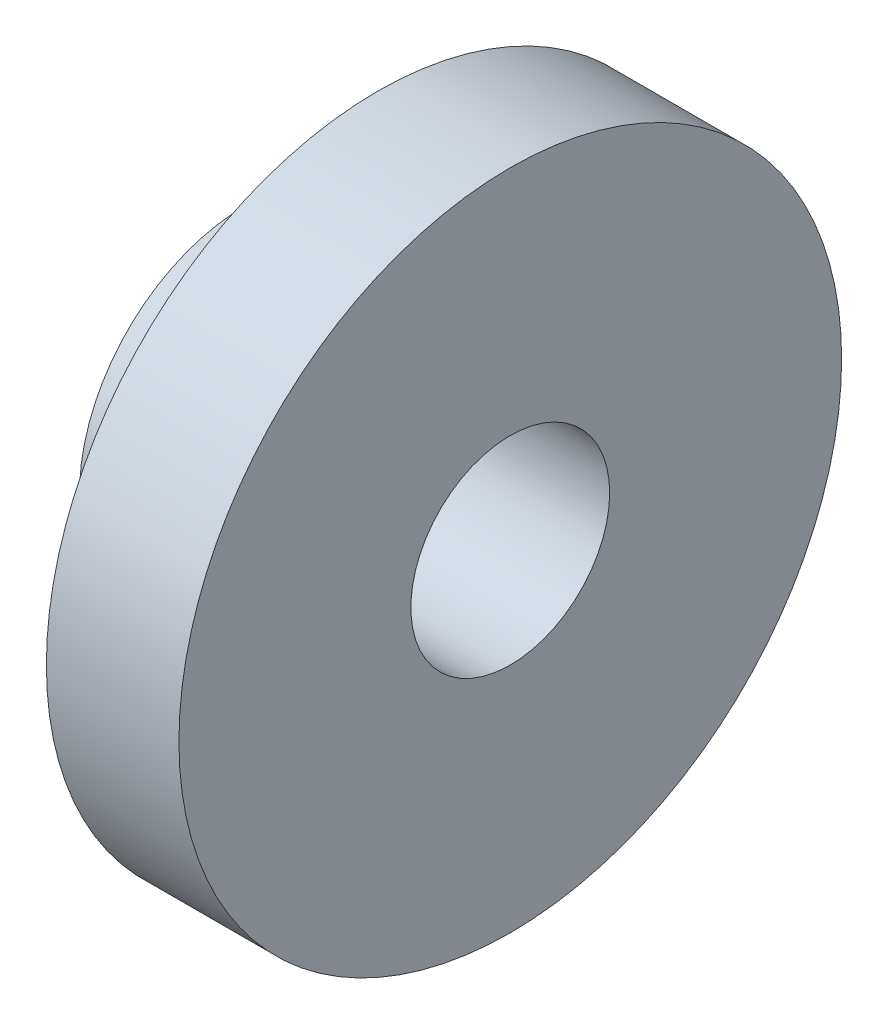
ISO-10303-21;
HEADER;
FILE_DESCRIPTION(('STEP AP214'),'2;1');
FILE_NAME('part.step','',(''),(''),'','','');
FILE_SCHEMA(('AUTOMOTIVE_DESIGN { 1 0 10303 214 1 1 1 1 }'));
ENDSEC;
DATA;
#1=APPLICATION_CONTEXT('core data for automotive mechanical design processes');
#2=APPLICATION_PROTOCOL_DEFINITION('international standard','automotive_design',2000,#1);
#3=PRODUCT_CONTEXT('',#1,'mechanical');
#4=PRODUCT('Part','Part','',(#3));
#5=PRODUCT_RELATED_PRODUCT_CATEGORY('part','',(#4));
#6=PRODUCT_DEFINITION_FORMATION('','',#4);
#7=PRODUCT_DEFINITION_CONTEXT('part definition',#1,'design');
#8=PRODUCT_DEFINITION('design','',#6,#7);
#9=PRODUCT_DEFINITION_SHAPE('','',#8);
#10=(LENGTH_UNIT() NAMED_UNIT(*) SI_UNIT(.MILLI.,.METRE.));
#11=(NAMED_UNIT(*) PLANE_ANGLE_UNIT() SI_UNIT($,.RADIAN.));
#12=(NAMED_UNIT(*) SI_UNIT($,.STERADIAN.) SOLID_ANGLE_UNIT());
#13=UNCERTAINTY_MEASURE_WITH_UNIT(LENGTH_MEASURE(1.E-05),#10,'distance_accuracy_value','');
#14=(GEOMETRIC_REPRESENTATION_CONTEXT(3) GLOBAL_UNCERTAINTY_ASSIGNED_CONTEXT((#13)) GLOBAL_UNIT_ASSIGNED_CONTEXT((#10,
#11,#12)) REPRESENTATION_CONTEXT('',''));
#15=CARTESIAN_POINT('',(0.,0.,0.));
#16=DIRECTION('',(0.,0.,1.));
#17=DIRECTION('',(1.,0.,0.));
#18=AXIS2_PLACEMENT_3D('',#15,#16,#17);
#19=CARTESIAN_POINT('',(0.,0.,0.));
#20=DIRECTION('',(1.,0.,0.));
#21=DIRECTION('',(0.,0.,-1.));
#22=AXIS2_PLACEMENT_3D('',#19,#20,#21);
#23=PLANE('',#22);
#24=CARTESIAN_POINT('',(0.,0.,0.));
#25=DIRECTION('',(1.,0.,0.));
#26=DIRECTION('',(0.,0.,-1.));
#27=AXIS2_PLACEMENT_3D('',#24,#25,#26);
#28=CIRCLE('',#27,2.5);
#29=CARTESIAN_POINT('',(0.,0.,-2.5));
#30=VERTEX_POINT('',#29);
#31=EDGE_CURVE('E37',#30,#30,#28,.T.);
#32=ORIENTED_EDGE('',*,*,#31,.F.);
#33=EDGE_LOOP('',(#32));
#34=FACE_BOUND('',#33,.T.);
#35=CARTESIAN_POINT('',(0.,0.,0.));
#36=DIRECTION('',(1.,0.,0.));
#37=DIRECTION('',(0.,0.,-1.));
#38=AXIS2_PLACEMENT_3D('',#35,#36,#37);
#39=CIRCLE('',#38,1.5);
#40=CARTESIAN_POINT('',(0.,0.,-1.5));
#41=VERTEX_POINT('',#40);
#42=EDGE_CURVE('E44',#41,#41,#39,.T.);
#43=ORIENTED_EDGE('',*,*,#42,.T.);
#44=EDGE_LOOP('',(#43));
#45=FACE_BOUND('',#44,.T.);
#46=ADVANCED_FACE('F33',(#34,#45),#23,.F.);
#47=CARTESIAN_POINT('',(2.,0.,0.));
#48=DIRECTION('',(-1.,0.,0.));
#49=DIRECTION('',(0.,0.,1.));
#50=AXIS2_PLACEMENT_3D('',#47,#48,#49);
#51=CYLINDRICAL_SURFACE('',#50,2.5);
#52=CARTESIAN_POINT('',(2.,0.,0.));
#53=DIRECTION('',(1.,0.,0.));
#54=DIRECTION('',(0.,0.,-1.));
#55=AXIS2_PLACEMENT_3D('',#52,#53,#54);
#56=CIRCLE('',#55,2.5);
#57=CARTESIAN_POINT('',(2.,0.,-2.5));
#58=VERTEX_POINT('',#57);
#59=EDGE_CURVE('E10',#58,#58,#56,.T.);
#60=ORIENTED_EDGE('',*,*,#59,.F.);
#61=EDGE_LOOP('',(#60));
#62=FACE_BOUND('',#61,.T.);
#63=ORIENTED_EDGE('',*,*,#31,.T.);
#64=EDGE_LOOP('',(#63));
#65=FACE_BOUND('',#64,.T.);
#66=ADVANCED_FACE('F35',(#62,#65),#51,.T.);
#67=CARTESIAN_POINT('',(2.,0.,0.));
#68=DIRECTION('',(-1.,0.,0.));
#69=DIRECTION('',(0.,0.,1.));
#70=AXIS2_PLACEMENT_3D('',#67,#68,#69);
#71=CYLINDRICAL_SURFACE('',#70,1.5);
#72=ORIENTED_EDGE('',*,*,#42,.F.);
#73=EDGE_LOOP('',(#72));
#74=FACE_BOUND('',#73,.T.);
#75=CARTESIAN_POINT('',(4.,0.,0.));
#76=DIRECTION('',(1.,0.,0.));
#77=DIRECTION('',(0.,0.,-1.));
#78=AXIS2_PLACEMENT_3D('',#75,#76,#77);
#79=CIRCLE('',#78,1.5);
#80=CARTESIAN_POINT('',(4.,0.,-1.5));
#81=VERTEX_POINT('',#80);
#82=EDGE_CURVE('E52',#81,#81,#79,.T.);
#83=ORIENTED_EDGE('',*,*,#82,.T.);
#84=EDGE_LOOP('',(#83));
#85=FACE_BOUND('',#84,.T.);
#86=ADVANCED_FACE('F58',(#74,#85),#71,.F.);
#87=CARTESIAN_POINT('',(2.,0.,0.));
#88=DIRECTION('',(1.,0.,0.));
#89=DIRECTION('',(0.,0.,-1.));
#90=AXIS2_PLACEMENT_3D('',#87,#88,#89);
#91=PLANE('',#90);
#92=CARTESIAN_POINT('',(2.,0.,0.));
#93=DIRECTION('',(1.,0.,0.));
#94=DIRECTION('',(0.,0.,-1.));
#95=AXIS2_PLACEMENT_3D('',#92,#93,#94);
#96=CIRCLE('',#95,5.);
#97=CARTESIAN_POINT('',(2.,0.,-5.));
#98=VERTEX_POINT('',#97);
#99=EDGE_CURVE('E49',#98,#98,#96,.T.);
#100=ORIENTED_EDGE('',*,*,#99,.F.);
#101=EDGE_LOOP('',(#100));
#102=FACE_BOUND('',#101,.T.);
#103=ORIENTED_EDGE('',*,*,#59,.T.);
#104=EDGE_LOOP('',(#103));
#105=FACE_BOUND('',#104,.T.);
#106=ADVANCED_FACE('F63',(#102,#105),#91,.F.);
#107=CARTESIAN_POINT('',(4.,0.,0.));
#108=DIRECTION('',(1.,0.,0.));
#109=DIRECTION('',(0.,0.,-1.));
#110=AXIS2_PLACEMENT_3D('',#107,#108,#109);
#111=PLANE('',#110);
#112=CARTESIAN_POINT('',(4.,0.,0.));
#113=DIRECTION('',(1.,0.,0.));
#114=DIRECTION('',(0.,0.,-1.));
#115=AXIS2_PLACEMENT_3D('',#112,#113,#114);
#116=CIRCLE('',#115,5.);
#117=CARTESIAN_POINT('',(4.,0.,-5.));
#118=VERTEX_POINT('',#117);
#119=EDGE_CURVE('E48',#118,#118,#116,.T.);
#120=ORIENTED_EDGE('',*,*,#119,.T.);
#121=EDGE_LOOP('',(#120));
#122=FACE_BOUND('',#121,.T.);
#123=ORIENTED_EDGE('',*,*,#82,.F.);
#124=EDGE_LOOP('',(#123));
#125=FACE_BOUND('',#124,.T.);
#126=ADVANCED_FACE('F60',(#122,#125),#111,.T.);
#127=CARTESIAN_POINT('',(4.,0.,0.));
#128=DIRECTION('',(-1.,0.,0.));
#129=DIRECTION('',(0.,0.,1.));
#130=AXIS2_PLACEMENT_3D('',#127,#128,#129);
#131=CYLINDRICAL_SURFACE('',#130,5.);
#132=ORIENTED_EDGE('',*,*,#119,.F.);
#133=EDGE_LOOP('',(#132));
#134=FACE_BOUND('',#133,.T.);
#135=ORIENTED_EDGE('',*,*,#99,.T.);
#136=EDGE_LOOP('',(#135));
#137=FACE_BOUND('',#136,.T.);
#138=ADVANCED_FACE('F62',(#134,#137),#131,.T.);
#139=CLOSED_SHELL('',(#46,#66,#86,#106,#126,#138));
#140=MANIFOLD_SOLID_BREP('B2',#139);
#141=ADVANCED_BREP_SHAPE_REPRESENTATION('',(#18,#140),#14);
#142=SHAPE_DEFINITION_REPRESENTATION(#9,#141);
ENDSEC;
END-ISO-10303-21;
